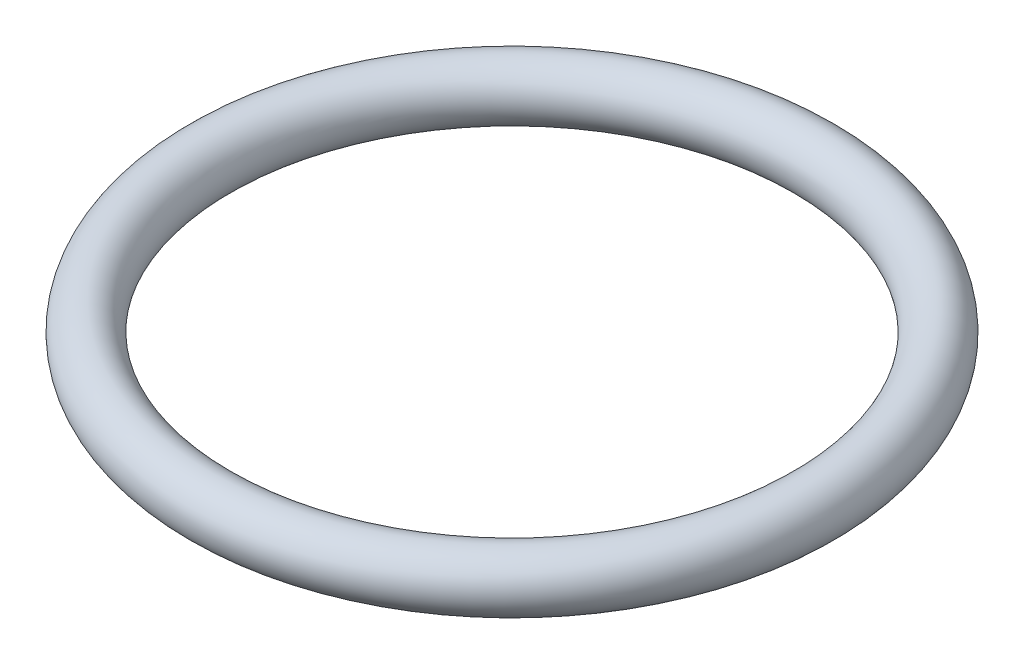
ISO-10303-21;
HEADER;
FILE_DESCRIPTION(('STEP AP214'),'2;1');
FILE_NAME('part.step','',(''),(''),'','','');
FILE_SCHEMA(('AUTOMOTIVE_DESIGN { 1 0 10303 214 1 1 1 1 }'));
ENDSEC;
DATA;
#1=APPLICATION_CONTEXT('core data for automotive mechanical design processes');
#2=APPLICATION_PROTOCOL_DEFINITION('international standard','automotive_design',2000,#1);
#3=PRODUCT_CONTEXT('',#1,'mechanical');
#4=PRODUCT('Part','Part','',(#3));
#5=PRODUCT_RELATED_PRODUCT_CATEGORY('part','',(#4));
#6=PRODUCT_DEFINITION_FORMATION('','',#4);
#7=PRODUCT_DEFINITION_CONTEXT('part definition',#1,'design');
#8=PRODUCT_DEFINITION('design','',#6,#7);
#9=PRODUCT_DEFINITION_SHAPE('','',#8);
#10=(LENGTH_UNIT() NAMED_UNIT(*) SI_UNIT(.MILLI.,.METRE.));
#11=(NAMED_UNIT(*) PLANE_ANGLE_UNIT() SI_UNIT($,.RADIAN.));
#12=(NAMED_UNIT(*) SI_UNIT($,.STERADIAN.) SOLID_ANGLE_UNIT());
#13=UNCERTAINTY_MEASURE_WITH_UNIT(LENGTH_MEASURE(1.E-05),#10,'distance_accuracy_value','');
#14=(GEOMETRIC_REPRESENTATION_CONTEXT(3) GLOBAL_UNCERTAINTY_ASSIGNED_CONTEXT((#13)) GLOBAL_UNIT_ASSIGNED_CONTEXT((#10,
#11,#12)) REPRESENTATION_CONTEXT('',''));
#15=CARTESIAN_POINT('',(0.,0.,0.));
#16=DIRECTION('',(0.,0.,1.));
#17=DIRECTION('',(1.,0.,0.));
#18=AXIS2_PLACEMENT_3D('',#15,#16,#17);
#19=CARTESIAN_POINT('',(0.,0.,0.));
#20=DIRECTION('',(0.,1.,0.));
#21=DIRECTION('',(0.,0.,1.));
#22=AXIS2_PLACEMENT_3D('',#19,#20,#21);
#23=TOROIDAL_SURFACE('',#22,6.4,0.6);
#24=CARTESIAN_POINT('',(0.,0.,7.));
#25=VERTEX_POINT('',#24);
#26=VERTEX_LOOP('',#25);
#27=FACE_BOUND('',#26,.T.);
#28=ADVANCED_FACE('F30',(#27),#23,.T.);
#29=CLOSED_SHELL('',(#28));
#30=MANIFOLD_SOLID_BREP('B2',#29);
#31=ADVANCED_BREP_SHAPE_REPRESENTATION('',(#18,#30),#14);
#32=SHAPE_DEFINITION_REPRESENTATION(#9,#31);
ENDSEC;
END-ISO-10303-21;
